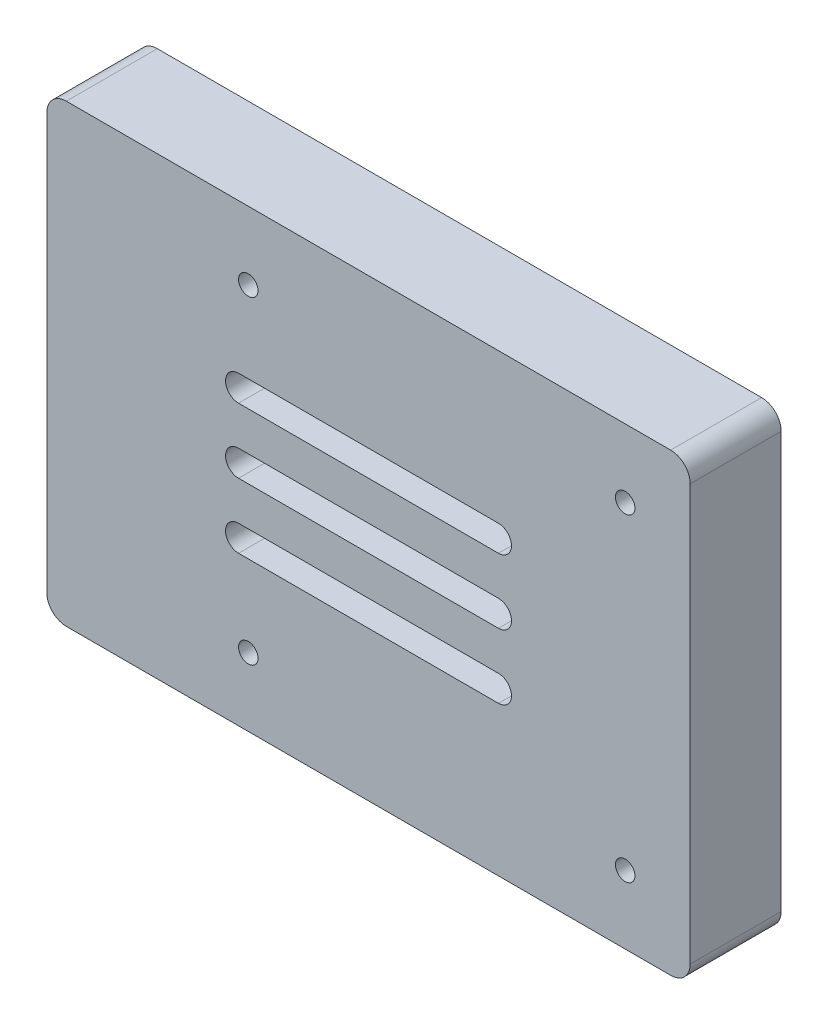
ISO-10303-21;
HEADER;
FILE_DESCRIPTION(('STEP AP214'),'2;1');
FILE_NAME('part.step','',(''),(''),'','','');
FILE_SCHEMA(('AUTOMOTIVE_DESIGN { 1 0 10303 214 1 1 1 1 }'));
ENDSEC;
DATA;
#1=APPLICATION_CONTEXT('core data for automotive mechanical design processes');
#2=APPLICATION_PROTOCOL_DEFINITION('international standard','automotive_design',2000,#1);
#3=PRODUCT_CONTEXT('',#1,'mechanical');
#4=PRODUCT('Part','Part','',(#3));
#5=PRODUCT_RELATED_PRODUCT_CATEGORY('part','',(#4));
#6=PRODUCT_DEFINITION_FORMATION('','',#4);
#7=PRODUCT_DEFINITION_CONTEXT('part definition',#1,'design');
#8=PRODUCT_DEFINITION('design','',#6,#7);
#9=PRODUCT_DEFINITION_SHAPE('','',#8);
#10=(LENGTH_UNIT() NAMED_UNIT(*) SI_UNIT(.MILLI.,.METRE.));
#11=(NAMED_UNIT(*) PLANE_ANGLE_UNIT() SI_UNIT($,.RADIAN.));
#12=(NAMED_UNIT(*) SI_UNIT($,.STERADIAN.) SOLID_ANGLE_UNIT());
#13=UNCERTAINTY_MEASURE_WITH_UNIT(LENGTH_MEASURE(1.E-05),#10,'distance_accuracy_value','');
#14=(GEOMETRIC_REPRESENTATION_CONTEXT(3) GLOBAL_UNCERTAINTY_ASSIGNED_CONTEXT((#13)) GLOBAL_UNIT_ASSIGNED_CONTEXT((#10,
#11,#12)) REPRESENTATION_CONTEXT('',''));
#15=CARTESIAN_POINT('',(0.,0.,0.));
#16=DIRECTION('',(0.,0.,1.));
#17=DIRECTION('',(1.,0.,0.));
#18=AXIS2_PLACEMENT_3D('',#15,#16,#17);
#19=CARTESIAN_POINT('',(0.,-35.,10.));
#20=DIRECTION('',(0.,1.,0.));
#21=DIRECTION('',(0.,0.,1.));
#22=AXIS2_PLACEMENT_3D('',#19,#20,#21);
#23=PLANE('',#22);
#24=DIRECTION('',(1.,0.,0.));
#25=VECTOR('',#24,1.);
#26=CARTESIAN_POINT('',(0.,-35.,0.));
#27=LINE('',#26,#25);
#28=CARTESIAN_POINT('',(-46.5,-35.,0.));
#29=VERTEX_POINT('',#28);
#30=CARTESIAN_POINT('',(46.5,-35.,0.));
#31=VERTEX_POINT('',#30);
#32=EDGE_CURVE('E487',#29,#31,#27,.T.);
#33=ORIENTED_EDGE('',*,*,#32,.T.);
#34=DIRECTION('',(0.,0.,-1.));
#35=VECTOR('',#34,1.);
#36=CARTESIAN_POINT('',(46.5,-35.,10.));
#37=LINE('',#36,#35);
#38=CARTESIAN_POINT('',(46.5,-35.,14.));
#39=VERTEX_POINT('',#38);
#40=EDGE_CURVE('E11',#39,#31,#37,.T.);
#41=ORIENTED_EDGE('',*,*,#40,.F.);
#42=DIRECTION('',(-1.,0.,0.));
#43=VECTOR('',#42,1.);
#44=CARTESIAN_POINT('',(0.,-35.,14.));
#45=LINE('',#44,#43);
#46=CARTESIAN_POINT('',(-46.5,-35.,14.));
#47=VERTEX_POINT('',#46);
#48=EDGE_CURVE('E418',#39,#47,#45,.T.);
#49=ORIENTED_EDGE('',*,*,#48,.T.);
#50=DIRECTION('',(0.,0.,-1.));
#51=VECTOR('',#50,1.);
#52=CARTESIAN_POINT('',(-46.5,-35.,10.));
#53=LINE('',#52,#51);
#54=EDGE_CURVE('E517',#47,#29,#53,.T.);
#55=ORIENTED_EDGE('',*,*,#54,.T.);
#56=EDGE_LOOP('',(#33,#41,#49,#55));
#57=FACE_BOUND('',#56,.T.);
#58=ADVANCED_FACE('F41',(#57),#23,.F.);
#59=CARTESIAN_POINT('',(46.5,-32.,10.));
#60=DIRECTION('',(0.,0.,-1.));
#61=DIRECTION('',(-1.,0.,0.));
#62=AXIS2_PLACEMENT_3D('',#59,#60,#61);
#63=CYLINDRICAL_SURFACE('',#62,3.);
#64=CARTESIAN_POINT('',(46.5,-32.,0.));
#65=DIRECTION('',(0.,0.,1.));
#66=DIRECTION('',(1.,0.,0.));
#67=AXIS2_PLACEMENT_3D('',#64,#65,#66);
#68=CIRCLE('',#67,3.);
#69=CARTESIAN_POINT('',(49.5,-32.,0.));
#70=VERTEX_POINT('',#69);
#71=EDGE_CURVE('E491',#31,#70,#68,.T.);
#72=ORIENTED_EDGE('',*,*,#71,.T.);
#73=DIRECTION('',(0.,0.,-1.));
#74=VECTOR('',#73,1.);
#75=CARTESIAN_POINT('',(49.5,-32.,10.));
#76=LINE('',#75,#74);
#77=CARTESIAN_POINT('',(49.5,-32.,14.));
#78=VERTEX_POINT('',#77);
#79=EDGE_CURVE('E51',#78,#70,#76,.T.);
#80=ORIENTED_EDGE('',*,*,#79,.F.);
#81=CARTESIAN_POINT('',(46.5,-32.,14.));
#82=DIRECTION('',(0.,0.,1.));
#83=DIRECTION('',(1.,0.,0.));
#84=AXIS2_PLACEMENT_3D('',#81,#82,#83);
#85=CIRCLE('',#84,3.);
#86=EDGE_CURVE('E422',#39,#78,#85,.T.);
#87=ORIENTED_EDGE('',*,*,#86,.F.);
#88=ORIENTED_EDGE('',*,*,#40,.T.);
#89=EDGE_LOOP('',(#72,#80,#87,#88));
#90=FACE_BOUND('',#89,.T.);
#91=ADVANCED_FACE('F611',(#90),#63,.T.);
#92=CARTESIAN_POINT('',(49.5,0.,10.));
#93=DIRECTION('',(-1.,0.,0.));
#94=DIRECTION('',(0.,-1.,0.));
#95=AXIS2_PLACEMENT_3D('',#92,#93,#94);
#96=PLANE('',#95);
#97=DIRECTION('',(0.,1.,0.));
#98=VECTOR('',#97,1.);
#99=CARTESIAN_POINT('',(49.5,0.,0.));
#100=LINE('',#99,#98);
#101=CARTESIAN_POINT('',(49.5,32.,0.));
#102=VERTEX_POINT('',#101);
#103=EDGE_CURVE('E494',#70,#102,#100,.T.);
#104=ORIENTED_EDGE('',*,*,#103,.T.);
#105=DIRECTION('',(0.,0.,-1.));
#106=VECTOR('',#105,1.);
#107=CARTESIAN_POINT('',(49.5,32.,10.));
#108=LINE('',#107,#106);
#109=CARTESIAN_POINT('',(49.5,32.,14.));
#110=VERTEX_POINT('',#109);
#111=EDGE_CURVE('E532',#110,#102,#108,.T.);
#112=ORIENTED_EDGE('',*,*,#111,.F.);
#113=DIRECTION('',(0.,-1.,0.));
#114=VECTOR('',#113,1.);
#115=CARTESIAN_POINT('',(49.5,0.,14.));
#116=LINE('',#115,#114);
#117=EDGE_CURVE('E426',#110,#78,#116,.T.);
#118=ORIENTED_EDGE('',*,*,#117,.T.);
#119=ORIENTED_EDGE('',*,*,#79,.T.);
#120=EDGE_LOOP('',(#104,#112,#118,#119));
#121=FACE_BOUND('',#120,.T.);
#122=ADVANCED_FACE('F617',(#121),#96,.F.);
#123=CARTESIAN_POINT('',(46.5,32.,10.));
#124=DIRECTION('',(0.,0.,-1.));
#125=DIRECTION('',(-1.,0.,0.));
#126=AXIS2_PLACEMENT_3D('',#123,#124,#125);
#127=CYLINDRICAL_SURFACE('',#126,3.);
#128=CARTESIAN_POINT('',(46.5,32.,0.));
#129=DIRECTION('',(0.,0.,1.));
#130=DIRECTION('',(1.,0.,0.));
#131=AXIS2_PLACEMENT_3D('',#128,#129,#130);
#132=CIRCLE('',#131,3.);
#133=CARTESIAN_POINT('',(46.5,35.,0.));
#134=VERTEX_POINT('',#133);
#135=EDGE_CURVE('E498',#134,#102,#132,.F.);
#136=ORIENTED_EDGE('',*,*,#135,.F.);
#137=DIRECTION('',(0.,0.,-1.));
#138=VECTOR('',#137,1.);
#139=CARTESIAN_POINT('',(46.5,35.,10.));
#140=LINE('',#139,#138);
#141=CARTESIAN_POINT('',(46.5,35.,14.));
#142=VERTEX_POINT('',#141);
#143=EDGE_CURVE('E529',#142,#134,#140,.T.);
#144=ORIENTED_EDGE('',*,*,#143,.F.);
#145=CARTESIAN_POINT('',(46.5,32.,14.));
#146=DIRECTION('',(0.,0.,1.));
#147=DIRECTION('',(1.,0.,0.));
#148=AXIS2_PLACEMENT_3D('',#145,#146,#147);
#149=CIRCLE('',#148,3.);
#150=EDGE_CURVE('E398',#110,#142,#149,.T.);
#151=ORIENTED_EDGE('',*,*,#150,.F.);
#152=ORIENTED_EDGE('',*,*,#111,.T.);
#153=EDGE_LOOP('',(#136,#144,#151,#152));
#154=FACE_BOUND('',#153,.T.);
#155=ADVANCED_FACE('F861',(#154),#127,.T.);
#156=CARTESIAN_POINT('',(0.,35.,10.));
#157=DIRECTION('',(0.,1.,0.));
#158=DIRECTION('',(0.,0.,1.));
#159=AXIS2_PLACEMENT_3D('',#156,#157,#158);
#160=PLANE('',#159);
#161=DIRECTION('',(1.,0.,0.));
#162=VECTOR('',#161,1.);
#163=CARTESIAN_POINT('',(0.,35.,0.));
#164=LINE('',#163,#162);
#165=CARTESIAN_POINT('',(-46.5,35.,0.));
#166=VERTEX_POINT('',#165);
#167=EDGE_CURVE('E502',#166,#134,#164,.T.);
#168=ORIENTED_EDGE('',*,*,#167,.F.);
#169=DIRECTION('',(0.,0.,-1.));
#170=VECTOR('',#169,1.);
#171=CARTESIAN_POINT('',(-46.5,35.,10.));
#172=LINE('',#171,#170);
#173=CARTESIAN_POINT('',(-46.5,35.,14.));
#174=VERTEX_POINT('',#173);
#175=EDGE_CURVE('E526',#174,#166,#172,.T.);
#176=ORIENTED_EDGE('',*,*,#175,.F.);
#177=DIRECTION('',(1.,0.,0.));
#178=VECTOR('',#177,1.);
#179=CARTESIAN_POINT('',(0.,35.,14.));
#180=LINE('',#179,#178);
#181=EDGE_CURVE('E402',#174,#142,#180,.T.);
#182=ORIENTED_EDGE('',*,*,#181,.T.);
#183=ORIENTED_EDGE('',*,*,#143,.T.);
#184=EDGE_LOOP('',(#168,#176,#182,#183));
#185=FACE_BOUND('',#184,.T.);
#186=ADVANCED_FACE('F849',(#185),#160,.T.);
#187=CARTESIAN_POINT('',(-46.5,32.,10.));
#188=DIRECTION('',(0.,0.,-1.));
#189=DIRECTION('',(-1.,0.,0.));
#190=AXIS2_PLACEMENT_3D('',#187,#188,#189);
#191=CYLINDRICAL_SURFACE('',#190,3.);
#192=CARTESIAN_POINT('',(-46.5,32.,0.));
#193=DIRECTION('',(0.,0.,1.));
#194=DIRECTION('',(1.,0.,0.));
#195=AXIS2_PLACEMENT_3D('',#192,#193,#194);
#196=CIRCLE('',#195,3.);
#197=CARTESIAN_POINT('',(-49.5,32.,0.));
#198=VERTEX_POINT('',#197);
#199=EDGE_CURVE('E506',#198,#166,#196,.F.);
#200=ORIENTED_EDGE('',*,*,#199,.F.);
#201=DIRECTION('',(0.,0.,-1.));
#202=VECTOR('',#201,1.);
#203=CARTESIAN_POINT('',(-49.5,32.,10.));
#204=LINE('',#203,#202);
#205=CARTESIAN_POINT('',(-49.5,32.,14.));
#206=VERTEX_POINT('',#205);
#207=EDGE_CURVE('E523',#206,#198,#204,.T.);
#208=ORIENTED_EDGE('',*,*,#207,.F.);
#209=CARTESIAN_POINT('',(-46.5,32.,14.));
#210=DIRECTION('',(0.,0.,1.));
#211=DIRECTION('',(1.,0.,0.));
#212=AXIS2_PLACEMENT_3D('',#209,#210,#211);
#213=CIRCLE('',#212,3.);
#214=EDGE_CURVE('E406',#174,#206,#213,.T.);
#215=ORIENTED_EDGE('',*,*,#214,.F.);
#216=ORIENTED_EDGE('',*,*,#175,.T.);
#217=EDGE_LOOP('',(#200,#208,#215,#216));
#218=FACE_BOUND('',#217,.T.);
#219=ADVANCED_FACE('F835',(#218),#191,.T.);
#220=CARTESIAN_POINT('',(-49.5,0.,10.));
#221=DIRECTION('',(-1.,0.,0.));
#222=DIRECTION('',(0.,0.,1.));
#223=AXIS2_PLACEMENT_3D('',#220,#221,#222);
#224=PLANE('',#223);
#225=DIRECTION('',(0.,1.,0.));
#226=VECTOR('',#225,1.);
#227=CARTESIAN_POINT('',(-49.5,0.,0.));
#228=LINE('',#227,#226);
#229=CARTESIAN_POINT('',(-49.5,-32.,0.));
#230=VERTEX_POINT('',#229);
#231=EDGE_CURVE('E510',#230,#198,#228,.T.);
#232=ORIENTED_EDGE('',*,*,#231,.F.);
#233=DIRECTION('',(0.,0.,-1.));
#234=VECTOR('',#233,1.);
#235=CARTESIAN_POINT('',(-49.5,-32.,10.));
#236=LINE('',#235,#234);
#237=CARTESIAN_POINT('',(-49.5,-32.,14.));
#238=VERTEX_POINT('',#237);
#239=EDGE_CURVE('E520',#238,#230,#236,.T.);
#240=ORIENTED_EDGE('',*,*,#239,.F.);
#241=DIRECTION('',(0.,1.,0.));
#242=VECTOR('',#241,1.);
#243=CARTESIAN_POINT('',(-49.5,0.,14.));
#244=LINE('',#243,#242);
#245=EDGE_CURVE('E410',#238,#206,#244,.T.);
#246=ORIENTED_EDGE('',*,*,#245,.T.);
#247=ORIENTED_EDGE('',*,*,#207,.T.);
#248=EDGE_LOOP('',(#232,#240,#246,#247));
#249=FACE_BOUND('',#248,.T.);
#250=ADVANCED_FACE('F828',(#249),#224,.T.);
#251=CARTESIAN_POINT('',(44.5,-30.,10.));
#252=DIRECTION('',(0.,0.,-1.));
#253=DIRECTION('',(-1.,0.,0.));
#254=AXIS2_PLACEMENT_3D('',#251,#252,#253);
#255=CYLINDRICAL_SURFACE('',#254,3.);
#256=CARTESIAN_POINT('',(44.5,-30.,0.));
#257=DIRECTION('',(0.,0.,1.));
#258=DIRECTION('',(1.,0.,0.));
#259=AXIS2_PLACEMENT_3D('',#256,#257,#258);
#260=CIRCLE('',#259,3.);
#261=CARTESIAN_POINT('',(44.5,-33.,0.));
#262=VERTEX_POINT('',#261);
#263=CARTESIAN_POINT('',(47.5,-30.,0.));
#264=VERTEX_POINT('',#263);
#265=EDGE_CURVE('E430',#262,#264,#260,.T.);
#266=ORIENTED_EDGE('',*,*,#265,.F.);
#267=DIRECTION('',(0.,0.,-1.));
#268=VECTOR('',#267,1.);
#269=CARTESIAN_POINT('',(44.5,-33.,10.));
#270=LINE('',#269,#268);
#271=CARTESIAN_POINT('',(44.5,-33.,10.));
#272=VERTEX_POINT('',#271);
#273=EDGE_CURVE('E45',#272,#262,#270,.T.);
#274=ORIENTED_EDGE('',*,*,#273,.F.);
#275=CARTESIAN_POINT('',(44.5,-30.,10.));
#276=DIRECTION('',(0.,0.,1.));
#277=DIRECTION('',(1.,0.,0.));
#278=AXIS2_PLACEMENT_3D('',#275,#276,#277);
#279=CIRCLE('',#278,3.);
#280=CARTESIAN_POINT('',(47.5,-30.,10.));
#281=VERTEX_POINT('',#280);
#282=EDGE_CURVE('E431',#272,#281,#279,.T.);
#283=ORIENTED_EDGE('',*,*,#282,.T.);
#284=DIRECTION('',(0.,0.,-1.));
#285=VECTOR('',#284,1.);
#286=CARTESIAN_POINT('',(47.5,-30.,10.));
#287=LINE('',#286,#285);
#288=EDGE_CURVE('E459',#281,#264,#287,.T.);
#289=ORIENTED_EDGE('',*,*,#288,.T.);
#290=EDGE_LOOP('',(#266,#274,#283,#289));
#291=FACE_BOUND('',#290,.T.);
#292=ADVANCED_FACE('F43',(#291),#255,.F.);
#293=CARTESIAN_POINT('',(0.,-33.,10.));
#294=DIRECTION('',(0.,1.,0.));
#295=DIRECTION('',(0.,0.,1.));
#296=AXIS2_PLACEMENT_3D('',#293,#294,#295);
#297=PLANE('',#296);
#298=DIRECTION('',(1.,0.,0.));
#299=VECTOR('',#298,1.);
#300=CARTESIAN_POINT('',(0.,-33.,0.));
#301=LINE('',#300,#299);
#302=CARTESIAN_POINT('',(-44.5,-33.,0.));
#303=VERTEX_POINT('',#302);
#304=EDGE_CURVE('E463',#303,#262,#301,.T.);
#305=ORIENTED_EDGE('',*,*,#304,.F.);
#306=DIRECTION('',(0.,0.,-1.));
#307=VECTOR('',#306,1.);
#308=CARTESIAN_POINT('',(-44.5,-33.,10.));
#309=LINE('',#308,#307);
#310=CARTESIAN_POINT('',(-44.5,-33.,10.));
#311=VERTEX_POINT('',#310);
#312=EDGE_CURVE('E558',#311,#303,#309,.T.);
#313=ORIENTED_EDGE('',*,*,#312,.F.);
#314=DIRECTION('',(1.,0.,0.));
#315=VECTOR('',#314,1.);
#316=CARTESIAN_POINT('',(0.,-33.,10.));
#317=LINE('',#316,#315);
#318=EDGE_CURVE('E435',#311,#272,#317,.T.);
#319=ORIENTED_EDGE('',*,*,#318,.T.);
#320=ORIENTED_EDGE('',*,*,#273,.T.);
#321=EDGE_LOOP('',(#305,#313,#319,#320));
#322=FACE_BOUND('',#321,.T.);
#323=ADVANCED_FACE('F569',(#322),#297,.T.);
#324=CARTESIAN_POINT('',(-44.5,-30.,10.));
#325=DIRECTION('',(0.,0.,-1.));
#326=DIRECTION('',(-1.,0.,0.));
#327=AXIS2_PLACEMENT_3D('',#324,#325,#326);
#328=CYLINDRICAL_SURFACE('',#327,3.);
#329=CARTESIAN_POINT('',(-44.5,-30.,0.));
#330=DIRECTION('',(0.,0.,1.));
#331=DIRECTION('',(1.,0.,0.));
#332=AXIS2_PLACEMENT_3D('',#329,#330,#331);
#333=CIRCLE('',#332,3.);
#334=CARTESIAN_POINT('',(-47.5,-30.,0.));
#335=VERTEX_POINT('',#334);
#336=EDGE_CURVE('E467',#303,#335,#333,.F.);
#337=ORIENTED_EDGE('',*,*,#336,.T.);
#338=DIRECTION('',(0.,0.,-1.));
#339=VECTOR('',#338,1.);
#340=CARTESIAN_POINT('',(-47.5,-30.,10.));
#341=LINE('',#340,#339);
#342=CARTESIAN_POINT('',(-47.5,-30.,10.));
#343=VERTEX_POINT('',#342);
#344=EDGE_CURVE('E555',#343,#335,#341,.T.);
#345=ORIENTED_EDGE('',*,*,#344,.F.);
#346=CARTESIAN_POINT('',(-44.5,-30.,10.));
#347=DIRECTION('',(0.,0.,1.));
#348=DIRECTION('',(1.,0.,0.));
#349=AXIS2_PLACEMENT_3D('',#346,#347,#348);
#350=CIRCLE('',#349,3.);
#351=EDGE_CURVE('E440',#311,#343,#350,.F.);
#352=ORIENTED_EDGE('',*,*,#351,.F.);
#353=ORIENTED_EDGE('',*,*,#312,.T.);
#354=EDGE_LOOP('',(#337,#345,#352,#353));
#355=FACE_BOUND('',#354,.T.);
#356=ADVANCED_FACE('F579',(#355),#328,.F.);
#357=CARTESIAN_POINT('',(-47.5,0.,10.));
#358=DIRECTION('',(-1.,0.,0.));
#359=DIRECTION('',(0.,0.,1.));
#360=AXIS2_PLACEMENT_3D('',#357,#358,#359);
#361=PLANE('',#360);
#362=DIRECTION('',(0.,1.,0.));
#363=VECTOR('',#362,1.);
#364=CARTESIAN_POINT('',(-47.5,0.,0.));
#365=LINE('',#364,#363);
#366=CARTESIAN_POINT('',(-47.5,30.,0.));
#367=VERTEX_POINT('',#366);
#368=EDGE_CURVE('E470',#335,#367,#365,.T.);
#369=ORIENTED_EDGE('',*,*,#368,.T.);
#370=DIRECTION('',(0.,0.,-1.));
#371=VECTOR('',#370,1.);
#372=CARTESIAN_POINT('',(-47.5,30.,10.));
#373=LINE('',#372,#371);
#374=CARTESIAN_POINT('',(-47.5,30.,10.));
#375=VERTEX_POINT('',#374);
#376=EDGE_CURVE('E551',#375,#367,#373,.T.);
#377=ORIENTED_EDGE('',*,*,#376,.F.);
#378=DIRECTION('',(0.,1.,0.));
#379=VECTOR('',#378,1.);
#380=CARTESIAN_POINT('',(-47.5,0.,10.));
#381=LINE('',#380,#379);
#382=EDGE_CURVE('E443',#343,#375,#381,.T.);
#383=ORIENTED_EDGE('',*,*,#382,.F.);
#384=ORIENTED_EDGE('',*,*,#344,.T.);
#385=EDGE_LOOP('',(#369,#377,#383,#384));
#386=FACE_BOUND('',#385,.T.);
#387=ADVANCED_FACE('F582',(#386),#361,.F.);
#388=CARTESIAN_POINT('',(-44.5,30.,10.));
#389=DIRECTION('',(0.,0.,-1.));
#390=DIRECTION('',(-1.,0.,0.));
#391=AXIS2_PLACEMENT_3D('',#388,#389,#390);
#392=CYLINDRICAL_SURFACE('',#391,3.);
#393=CARTESIAN_POINT('',(-44.5,30.,0.));
#394=DIRECTION('',(0.,0.,1.));
#395=DIRECTION('',(1.,0.,0.));
#396=AXIS2_PLACEMENT_3D('',#393,#394,#395);
#397=CIRCLE('',#396,3.);
#398=CARTESIAN_POINT('',(-44.5,33.,0.));
#399=VERTEX_POINT('',#398);
#400=EDGE_CURVE('E473',#367,#399,#397,.F.);
#401=ORIENTED_EDGE('',*,*,#400,.T.);
#402=DIRECTION('',(0.,0.,-1.));
#403=VECTOR('',#402,1.);
#404=CARTESIAN_POINT('',(-44.5,33.,10.));
#405=LINE('',#404,#403);
#406=CARTESIAN_POINT('',(-44.5,33.,10.));
#407=VERTEX_POINT('',#406);
#408=EDGE_CURVE('E547',#407,#399,#405,.T.);
#409=ORIENTED_EDGE('',*,*,#408,.F.);
#410=CARTESIAN_POINT('',(-44.5,30.,10.));
#411=DIRECTION('',(0.,0.,1.));
#412=DIRECTION('',(1.,0.,0.));
#413=AXIS2_PLACEMENT_3D('',#410,#411,#412);
#414=CIRCLE('',#413,3.);
#415=EDGE_CURVE('E446',#375,#407,#414,.F.);
#416=ORIENTED_EDGE('',*,*,#415,.F.);
#417=ORIENTED_EDGE('',*,*,#376,.T.);
#418=EDGE_LOOP('',(#401,#409,#416,#417));
#419=FACE_BOUND('',#418,.T.);
#420=ADVANCED_FACE('F601',(#419),#392,.F.);
#421=CARTESIAN_POINT('',(0.,33.,10.));
#422=DIRECTION('',(0.,1.,0.));
#423=DIRECTION('',(0.,0.,1.));
#424=AXIS2_PLACEMENT_3D('',#421,#422,#423);
#425=PLANE('',#424);
#426=DIRECTION('',(1.,0.,0.));
#427=VECTOR('',#426,1.);
#428=CARTESIAN_POINT('',(0.,33.,0.));
#429=LINE('',#428,#427);
#430=CARTESIAN_POINT('',(44.5,33.,0.));
#431=VERTEX_POINT('',#430);
#432=EDGE_CURVE('E476',#399,#431,#429,.T.);
#433=ORIENTED_EDGE('',*,*,#432,.T.);
#434=DIRECTION('',(0.,0.,-1.));
#435=VECTOR('',#434,1.);
#436=CARTESIAN_POINT('',(44.5,33.,10.));
#437=LINE('',#436,#435);
#438=CARTESIAN_POINT('',(44.5,33.,10.));
#439=VERTEX_POINT('',#438);
#440=EDGE_CURVE('E543',#439,#431,#437,.T.);
#441=ORIENTED_EDGE('',*,*,#440,.F.);
#442=DIRECTION('',(1.,0.,0.));
#443=VECTOR('',#442,1.);
#444=CARTESIAN_POINT('',(0.,33.,10.));
#445=LINE('',#444,#443);
#446=EDGE_CURVE('E449',#407,#439,#445,.T.);
#447=ORIENTED_EDGE('',*,*,#446,.F.);
#448=ORIENTED_EDGE('',*,*,#408,.T.);
#449=EDGE_LOOP('',(#433,#441,#447,#448));
#450=FACE_BOUND('',#449,.T.);
#451=ADVANCED_FACE('F599',(#450),#425,.F.);
#452=CARTESIAN_POINT('',(44.5,30.,10.));
#453=DIRECTION('',(0.,0.,-1.));
#454=DIRECTION('',(-1.,0.,0.));
#455=AXIS2_PLACEMENT_3D('',#452,#453,#454);
#456=CYLINDRICAL_SURFACE('',#455,3.);
#457=CARTESIAN_POINT('',(44.5,30.,0.));
#458=DIRECTION('',(0.,0.,1.));
#459=DIRECTION('',(1.,0.,0.));
#460=AXIS2_PLACEMENT_3D('',#457,#458,#459);
#461=CIRCLE('',#460,3.);
#462=CARTESIAN_POINT('',(47.5,30.,0.));
#463=VERTEX_POINT('',#462);
#464=EDGE_CURVE('E479',#431,#463,#461,.F.);
#465=ORIENTED_EDGE('',*,*,#464,.T.);
#466=DIRECTION('',(0.,0.,-1.));
#467=VECTOR('',#466,1.);
#468=CARTESIAN_POINT('',(47.5,30.,10.));
#469=LINE('',#468,#467);
#470=CARTESIAN_POINT('',(47.5,30.,10.));
#471=VERTEX_POINT('',#470);
#472=EDGE_CURVE('E540',#471,#463,#469,.T.);
#473=ORIENTED_EDGE('',*,*,#472,.F.);
#474=CARTESIAN_POINT('',(44.5,30.,10.));
#475=DIRECTION('',(0.,0.,1.));
#476=DIRECTION('',(1.,0.,0.));
#477=AXIS2_PLACEMENT_3D('',#474,#475,#476);
#478=CIRCLE('',#477,3.);
#479=EDGE_CURVE('E452',#439,#471,#478,.F.);
#480=ORIENTED_EDGE('',*,*,#479,.F.);
#481=ORIENTED_EDGE('',*,*,#440,.T.);
#482=EDGE_LOOP('',(#465,#473,#480,#481));
#483=FACE_BOUND('',#482,.T.);
#484=ADVANCED_FACE('F595',(#483),#456,.F.);
#485=CARTESIAN_POINT('',(47.5,0.,10.));
#486=DIRECTION('',(-1.,0.,0.));
#487=DIRECTION('',(0.,0.,1.));
#488=AXIS2_PLACEMENT_3D('',#485,#486,#487);
#489=PLANE('',#488);
#490=DIRECTION('',(0.,1.,0.));
#491=VECTOR('',#490,1.);
#492=CARTESIAN_POINT('',(47.5,0.,0.));
#493=LINE('',#492,#491);
#494=EDGE_CURVE('E483',#264,#463,#493,.T.);
#495=ORIENTED_EDGE('',*,*,#494,.F.);
#496=ORIENTED_EDGE('',*,*,#288,.F.);
#497=DIRECTION('',(0.,1.,0.));
#498=VECTOR('',#497,1.);
#499=CARTESIAN_POINT('',(47.5,0.,10.));
#500=LINE('',#499,#498);
#501=EDGE_CURVE('E455',#281,#471,#500,.T.);
#502=ORIENTED_EDGE('',*,*,#501,.T.);
#503=ORIENTED_EDGE('',*,*,#472,.T.);
#504=EDGE_LOOP('',(#495,#496,#502,#503));
#505=FACE_BOUND('',#504,.T.);
#506=ADVANCED_FACE('F591',(#505),#489,.T.);
#507=CARTESIAN_POINT('',(-46.5,-32.,10.));
#508=DIRECTION('',(0.,0.,-1.));
#509=DIRECTION('',(-1.,0.,0.));
#510=AXIS2_PLACEMENT_3D('',#507,#508,#509);
#511=CYLINDRICAL_SURFACE('',#510,3.);
#512=CARTESIAN_POINT('',(-46.5,-32.,0.));
#513=DIRECTION('',(0.,0.,1.));
#514=DIRECTION('',(1.,0.,0.));
#515=AXIS2_PLACEMENT_3D('',#512,#513,#514);
#516=CIRCLE('',#515,3.);
#517=EDGE_CURVE('E436',#29,#230,#516,.F.);
#518=ORIENTED_EDGE('',*,*,#517,.F.);
#519=ORIENTED_EDGE('',*,*,#54,.F.);
#520=CARTESIAN_POINT('',(-46.5,-32.,14.));
#521=DIRECTION('',(0.,0.,1.));
#522=DIRECTION('',(1.,0.,0.));
#523=AXIS2_PLACEMENT_3D('',#520,#521,#522);
#524=CIRCLE('',#523,3.);
#525=EDGE_CURVE('E414',#238,#47,#524,.T.);
#526=ORIENTED_EDGE('',*,*,#525,.F.);
#527=ORIENTED_EDGE('',*,*,#239,.T.);
#528=EDGE_LOOP('',(#518,#519,#526,#527));
#529=FACE_BOUND('',#528,.T.);
#530=ADVANCED_FACE('F624',(#529),#511,.T.);
#531=CARTESIAN_POINT('',(0.,0.,0.));
#532=DIRECTION('',(0.,0.,1.));
#533=DIRECTION('',(1.,0.,0.));
#534=AXIS2_PLACEMENT_3D('',#531,#532,#533);
#535=PLANE('',#534);
#536=ORIENTED_EDGE('',*,*,#265,.T.);
#537=ORIENTED_EDGE('',*,*,#494,.T.);
#538=ORIENTED_EDGE('',*,*,#464,.F.);
#539=ORIENTED_EDGE('',*,*,#432,.F.);
#540=ORIENTED_EDGE('',*,*,#400,.F.);
#541=ORIENTED_EDGE('',*,*,#368,.F.);
#542=ORIENTED_EDGE('',*,*,#336,.F.);
#543=ORIENTED_EDGE('',*,*,#304,.T.);
#544=EDGE_LOOP('',(#536,#537,#538,#539,#540,#541,#542,#543));
#545=FACE_BOUND('',#544,.T.);
#546=ORIENTED_EDGE('',*,*,#32,.F.);
#547=ORIENTED_EDGE('',*,*,#517,.T.);
#548=ORIENTED_EDGE('',*,*,#231,.T.);
#549=ORIENTED_EDGE('',*,*,#199,.T.);
#550=ORIENTED_EDGE('',*,*,#167,.T.);
#551=ORIENTED_EDGE('',*,*,#135,.T.);
#552=ORIENTED_EDGE('',*,*,#103,.F.);
#553=ORIENTED_EDGE('',*,*,#71,.F.);
#554=EDGE_LOOP('',(#546,#547,#548,#549,#550,#551,#552,#553));
#555=FACE_BOUND('',#554,.T.);
#556=ADVANCED_FACE('F574',(#545,#555),#535,.F.);
#557=CARTESIAN_POINT('',(46.5,32.,10.));
#558=DIRECTION('',(0.,0.,1.));
#559=DIRECTION('',(1.,0.,0.));
#560=AXIS2_PLACEMENT_3D('',#557,#558,#559);
#561=PLANE('',#560);
#562=DIRECTION('',(1.,0.,0.));
#563=VECTOR('',#562,1.);
#564=CARTESIAN_POINT('',(46.5,7.99999999999999,10.));
#565=LINE('',#564,#563);
#566=CARTESIAN_POINT('',(-20.,8.,10.));
#567=VERTEX_POINT('',#566);
#568=CARTESIAN_POINT('',(20.,7.99999999999999,10.));
#569=VERTEX_POINT('',#568);
#570=EDGE_CURVE('E358',#567,#569,#565,.T.);
#571=ORIENTED_EDGE('',*,*,#570,.T.);
#572=CARTESIAN_POINT('',(20.,10.,10.));
#573=DIRECTION('',(0.,0.,1.));
#574=DIRECTION('',(1.,0.,0.));
#575=AXIS2_PLACEMENT_3D('',#572,#573,#574);
#576=CIRCLE('',#575,2.);
#577=CARTESIAN_POINT('',(20.,12.,10.));
#578=VERTEX_POINT('',#577);
#579=EDGE_CURVE('E362',#569,#578,#576,.T.);
#580=ORIENTED_EDGE('',*,*,#579,.T.);
#581=DIRECTION('',(-1.,0.,0.));
#582=VECTOR('',#581,1.);
#583=CARTESIAN_POINT('',(46.5,12.,10.));
#584=LINE('',#583,#582);
#585=CARTESIAN_POINT('',(-20.,12.,10.));
#586=VERTEX_POINT('',#585);
#587=EDGE_CURVE('E350',#578,#586,#584,.T.);
#588=ORIENTED_EDGE('',*,*,#587,.T.);
#589=CARTESIAN_POINT('',(-20.,10.,10.));
#590=DIRECTION('',(0.,0.,1.));
#591=DIRECTION('',(1.,0.,0.));
#592=AXIS2_PLACEMENT_3D('',#589,#590,#591);
#593=CIRCLE('',#592,2.);
#594=EDGE_CURVE('E354',#586,#567,#593,.T.);
#595=ORIENTED_EDGE('',*,*,#594,.T.);
#596=EDGE_LOOP('',(#571,#580,#588,#595));
#597=FACE_BOUND('',#596,.T.);
#598=DIRECTION('',(1.,0.,0.));
#599=VECTOR('',#598,1.);
#600=CARTESIAN_POINT('',(46.5,-12.,10.));
#601=LINE('',#600,#599);
#602=CARTESIAN_POINT('',(-19.9999999999999,-12.,10.));
#603=VERTEX_POINT('',#602);
#604=CARTESIAN_POINT('',(20.0000000000001,-12.,10.));
#605=VERTEX_POINT('',#604);
#606=EDGE_CURVE('E342',#603,#605,#601,.T.);
#607=ORIENTED_EDGE('',*,*,#606,.T.);
#608=CARTESIAN_POINT('',(20.0000000000001,-10.,10.));
#609=DIRECTION('',(0.,0.,1.));
#610=DIRECTION('',(1.,0.,0.));
#611=AXIS2_PLACEMENT_3D('',#608,#609,#610);
#612=CIRCLE('',#611,2.);
#613=CARTESIAN_POINT('',(20.0000000000001,-8.,10.));
#614=VERTEX_POINT('',#613);
#615=EDGE_CURVE('E346',#605,#614,#612,.T.);
#616=ORIENTED_EDGE('',*,*,#615,.T.);
#617=DIRECTION('',(-1.,0.,0.));
#618=VECTOR('',#617,1.);
#619=CARTESIAN_POINT('',(46.5,-8.00000000000001,10.));
#620=LINE('',#619,#618);
#621=CARTESIAN_POINT('',(-19.9999999999999,-8.,10.));
#622=VERTEX_POINT('',#621);
#623=EDGE_CURVE('E337',#614,#622,#620,.T.);
#624=ORIENTED_EDGE('',*,*,#623,.T.);
#625=CARTESIAN_POINT('',(-19.9999999999999,-10.,10.));
#626=DIRECTION('',(0.,0.,1.));
#627=DIRECTION('',(1.,0.,0.));
#628=AXIS2_PLACEMENT_3D('',#625,#626,#627);
#629=CIRCLE('',#628,2.);
#630=EDGE_CURVE('E234',#622,#603,#629,.T.);
#631=ORIENTED_EDGE('',*,*,#630,.T.);
#632=EDGE_LOOP('',(#607,#616,#624,#631));
#633=FACE_BOUND('',#632,.T.);
#634=DIRECTION('',(1.,0.,0.));
#635=VECTOR('',#634,1.);
#636=CARTESIAN_POINT('',(46.5,-2.00000000000002,10.));
#637=LINE('',#636,#635);
#638=CARTESIAN_POINT('',(-20.,-2.,10.));
#639=VERTEX_POINT('',#638);
#640=CARTESIAN_POINT('',(20.,-2.00000000000001,10.));
#641=VERTEX_POINT('',#640);
#642=EDGE_CURVE('E329',#639,#641,#637,.T.);
#643=ORIENTED_EDGE('',*,*,#642,.T.);
#644=CARTESIAN_POINT('',(20.,0.,10.));
#645=DIRECTION('',(0.,0.,1.));
#646=DIRECTION('',(1.,0.,0.));
#647=AXIS2_PLACEMENT_3D('',#644,#645,#646);
#648=CIRCLE('',#647,2.);
#649=CARTESIAN_POINT('',(20.,2.,10.));
#650=VERTEX_POINT('',#649);
#651=EDGE_CURVE('E333',#641,#650,#648,.T.);
#652=ORIENTED_EDGE('',*,*,#651,.T.);
#653=DIRECTION('',(-1.,0.,0.));
#654=VECTOR('',#653,1.);
#655=CARTESIAN_POINT('',(46.5,1.99999999999999,10.));
#656=LINE('',#655,#654);
#657=CARTESIAN_POINT('',(-20.,2.,10.));
#658=VERTEX_POINT('',#657);
#659=EDGE_CURVE('E312',#650,#658,#656,.T.);
#660=ORIENTED_EDGE('',*,*,#659,.T.);
#661=CARTESIAN_POINT('',(-20.,0.,10.));
#662=DIRECTION('',(0.,0.,1.));
#663=DIRECTION('',(1.,0.,0.));
#664=AXIS2_PLACEMENT_3D('',#661,#662,#663);
#665=CIRCLE('',#664,2.);
#666=EDGE_CURVE('E325',#658,#639,#665,.T.);
#667=ORIENTED_EDGE('',*,*,#666,.T.);
#668=EDGE_LOOP('',(#643,#652,#660,#667));
#669=FACE_BOUND('',#668,.T.);
#670=CARTESIAN_POINT('',(-18.5,24.5,10.));
#671=DIRECTION('',(0.,0.,1.));
#672=DIRECTION('',(1.,0.,0.));
#673=AXIS2_PLACEMENT_3D('',#670,#671,#672);
#674=CIRCLE('',#673,1.5);
#675=CARTESIAN_POINT('',(-17.,24.5,10.));
#676=VERTEX_POINT('',#675);
#677=EDGE_CURVE('E394',#676,#676,#674,.T.);
#678=ORIENTED_EDGE('',*,*,#677,.T.);
#679=EDGE_LOOP('',(#678));
#680=FACE_BOUND('',#679,.T.);
#681=CARTESIAN_POINT('',(39.5,-24.5,10.));
#682=DIRECTION('',(0.,0.,1.));
#683=DIRECTION('',(1.,0.,0.));
#684=AXIS2_PLACEMENT_3D('',#681,#682,#683);
#685=CIRCLE('',#684,1.5);
#686=CARTESIAN_POINT('',(41.,-24.5,10.));
#687=VERTEX_POINT('',#686);
#688=EDGE_CURVE('E390',#687,#687,#685,.T.);
#689=ORIENTED_EDGE('',*,*,#688,.T.);
#690=EDGE_LOOP('',(#689));
#691=FACE_BOUND('',#690,.T.);
#692=CARTESIAN_POINT('',(-18.5,-24.5,10.));
#693=DIRECTION('',(0.,0.,1.));
#694=DIRECTION('',(1.,0.,0.));
#695=AXIS2_PLACEMENT_3D('',#692,#693,#694);
#696=CIRCLE('',#695,1.5);
#697=CARTESIAN_POINT('',(-17.,-24.5,10.));
#698=VERTEX_POINT('',#697);
#699=EDGE_CURVE('E386',#698,#698,#696,.T.);
#700=ORIENTED_EDGE('',*,*,#699,.T.);
#701=EDGE_LOOP('',(#700));
#702=FACE_BOUND('',#701,.T.);
#703=CARTESIAN_POINT('',(39.5,24.5,10.));
#704=DIRECTION('',(0.,0.,1.));
#705=DIRECTION('',(1.,0.,0.));
#706=AXIS2_PLACEMENT_3D('',#703,#704,#705);
#707=CIRCLE('',#706,1.5);
#708=CARTESIAN_POINT('',(41.,24.5,10.));
#709=VERTEX_POINT('',#708);
#710=EDGE_CURVE('E382',#709,#709,#707,.T.);
#711=ORIENTED_EDGE('',*,*,#710,.T.);
#712=EDGE_LOOP('',(#711));
#713=FACE_BOUND('',#712,.T.);
#714=ORIENTED_EDGE('',*,*,#282,.F.);
#715=ORIENTED_EDGE('',*,*,#318,.F.);
#716=ORIENTED_EDGE('',*,*,#351,.T.);
#717=ORIENTED_EDGE('',*,*,#382,.T.);
#718=ORIENTED_EDGE('',*,*,#415,.T.);
#719=ORIENTED_EDGE('',*,*,#446,.T.);
#720=ORIENTED_EDGE('',*,*,#479,.T.);
#721=ORIENTED_EDGE('',*,*,#501,.F.);
#722=EDGE_LOOP('',(#714,#715,#716,#717,#718,#719,#720,#721));
#723=FACE_BOUND('',#722,.T.);
#724=ADVANCED_FACE('F586',(#597,#633,#669,#680,#691,#702,#713,#723),#561,.F.);
#725=CARTESIAN_POINT('',(46.5,32.,14.));
#726=DIRECTION('',(0.,0.,1.));
#727=DIRECTION('',(1.,0.,0.));
#728=AXIS2_PLACEMENT_3D('',#725,#726,#727);
#729=PLANE('',#728);
#730=CARTESIAN_POINT('',(20.,10.,14.));
#731=DIRECTION('',(0.,0.,1.));
#732=DIRECTION('',(1.,0.,0.));
#733=AXIS2_PLACEMENT_3D('',#730,#731,#732);
#734=CIRCLE('',#733,2.);
#735=CARTESIAN_POINT('',(20.,7.99999999999999,14.));
#736=VERTEX_POINT('',#735);
#737=CARTESIAN_POINT('',(20.,12.,14.));
#738=VERTEX_POINT('',#737);
#739=EDGE_CURVE('E268',#736,#738,#734,.T.);
#740=ORIENTED_EDGE('',*,*,#739,.F.);
#741=DIRECTION('',(1.,0.,0.));
#742=VECTOR('',#741,1.);
#743=CARTESIAN_POINT('',(20.,7.99999999999999,14.));
#744=LINE('',#743,#742);
#745=CARTESIAN_POINT('',(-20.,8.,14.));
#746=VERTEX_POINT('',#745);
#747=EDGE_CURVE('E278',#746,#736,#744,.T.);
#748=ORIENTED_EDGE('',*,*,#747,.F.);
#749=CARTESIAN_POINT('',(-20.,10.,14.));
#750=DIRECTION('',(0.,0.,1.));
#751=DIRECTION('',(1.,0.,0.));
#752=AXIS2_PLACEMENT_3D('',#749,#750,#751);
#753=CIRCLE('',#752,2.);
#754=CARTESIAN_POINT('',(-20.,12.,14.));
#755=VERTEX_POINT('',#754);
#756=EDGE_CURVE('E274',#755,#746,#753,.T.);
#757=ORIENTED_EDGE('',*,*,#756,.F.);
#758=DIRECTION('',(-1.,0.,0.));
#759=VECTOR('',#758,1.);
#760=CARTESIAN_POINT('',(20.,12.,14.));
#761=LINE('',#760,#759);
#762=EDGE_CURVE('E271',#738,#755,#761,.T.);
#763=ORIENTED_EDGE('',*,*,#762,.F.);
#764=EDGE_LOOP('',(#740,#748,#757,#763));
#765=FACE_BOUND('',#764,.T.);
#766=CARTESIAN_POINT('',(20.0000000000001,-10.,14.));
#767=DIRECTION('',(0.,0.,1.));
#768=DIRECTION('',(1.,0.,0.));
#769=AXIS2_PLACEMENT_3D('',#766,#767,#768);
#770=CIRCLE('',#769,2.);
#771=CARTESIAN_POINT('',(20.0000000000001,-12.,14.));
#772=VERTEX_POINT('',#771);
#773=CARTESIAN_POINT('',(20.0000000000001,-8.,14.));
#774=VERTEX_POINT('',#773);
#775=EDGE_CURVE('E248',#772,#774,#770,.T.);
#776=ORIENTED_EDGE('',*,*,#775,.F.);
#777=DIRECTION('',(1.,0.,0.));
#778=VECTOR('',#777,1.);
#779=CARTESIAN_POINT('',(20.0000000000001,-12.,14.));
#780=LINE('',#779,#778);
#781=CARTESIAN_POINT('',(-19.9999999999999,-12.,14.));
#782=VERTEX_POINT('',#781);
#783=EDGE_CURVE('E253',#782,#772,#780,.T.);
#784=ORIENTED_EDGE('',*,*,#783,.F.);
#785=CARTESIAN_POINT('',(-19.9999999999999,-10.,14.));
#786=DIRECTION('',(0.,0.,1.));
#787=DIRECTION('',(1.,0.,0.));
#788=AXIS2_PLACEMENT_3D('',#785,#786,#787);
#789=CIRCLE('',#788,2.);
#790=CARTESIAN_POINT('',(-19.9999999999999,-8.,14.));
#791=VERTEX_POINT('',#790);
#792=EDGE_CURVE('E231',#791,#782,#789,.T.);
#793=ORIENTED_EDGE('',*,*,#792,.F.);
#794=DIRECTION('',(-1.,0.,0.));
#795=VECTOR('',#794,1.);
#796=CARTESIAN_POINT('',(20.0000000000001,-8.,14.));
#797=LINE('',#796,#795);
#798=EDGE_CURVE('E242',#774,#791,#797,.T.);
#799=ORIENTED_EDGE('',*,*,#798,.F.);
#800=EDGE_LOOP('',(#776,#784,#793,#799));
#801=FACE_BOUND('',#800,.T.);
#802=CARTESIAN_POINT('',(20.,0.,14.));
#803=DIRECTION('',(0.,0.,1.));
#804=DIRECTION('',(1.,0.,0.));
#805=AXIS2_PLACEMENT_3D('',#802,#803,#804);
#806=CIRCLE('',#805,2.);
#807=CARTESIAN_POINT('',(20.,-2.00000000000001,14.));
#808=VERTEX_POINT('',#807);
#809=CARTESIAN_POINT('',(20.,2.,14.));
#810=VERTEX_POINT('',#809);
#811=EDGE_CURVE('E263',#808,#810,#806,.T.);
#812=ORIENTED_EDGE('',*,*,#811,.F.);
#813=DIRECTION('',(1.,0.,0.));
#814=VECTOR('',#813,1.);
#815=CARTESIAN_POINT('',(20.,-2.00000000000001,14.));
#816=LINE('',#815,#814);
#817=CARTESIAN_POINT('',(-20.,-2.,14.));
#818=VERTEX_POINT('',#817);
#819=EDGE_CURVE('E304',#818,#808,#816,.T.);
#820=ORIENTED_EDGE('',*,*,#819,.F.);
#821=CARTESIAN_POINT('',(-20.,0.,14.));
#822=DIRECTION('',(0.,0.,1.));
#823=DIRECTION('',(1.,0.,0.));
#824=AXIS2_PLACEMENT_3D('',#821,#822,#823);
#825=CIRCLE('',#824,2.);
#826=CARTESIAN_POINT('',(-20.,2.,14.));
#827=VERTEX_POINT('',#826);
#828=EDGE_CURVE('E300',#827,#818,#825,.T.);
#829=ORIENTED_EDGE('',*,*,#828,.F.);
#830=DIRECTION('',(-1.,0.,0.));
#831=VECTOR('',#830,1.);
#832=CARTESIAN_POINT('',(20.,2.,14.));
#833=LINE('',#832,#831);
#834=EDGE_CURVE('E296',#810,#827,#833,.T.);
#835=ORIENTED_EDGE('',*,*,#834,.F.);
#836=EDGE_LOOP('',(#812,#820,#829,#835));
#837=FACE_BOUND('',#836,.T.);
#838=CARTESIAN_POINT('',(-18.5,24.5,14.));
#839=DIRECTION('',(0.,0.,1.));
#840=DIRECTION('',(1.,0.,0.));
#841=AXIS2_PLACEMENT_3D('',#838,#839,#840);
#842=CIRCLE('',#841,1.5);
#843=CARTESIAN_POINT('',(-17.,24.5,14.));
#844=VERTEX_POINT('',#843);
#845=EDGE_CURVE('E371',#844,#844,#842,.T.);
#846=ORIENTED_EDGE('',*,*,#845,.F.);
#847=EDGE_LOOP('',(#846));
#848=FACE_BOUND('',#847,.T.);
#849=CARTESIAN_POINT('',(39.5,-24.5,14.));
#850=DIRECTION('',(0.,0.,1.));
#851=DIRECTION('',(-1.,0.,0.));
#852=AXIS2_PLACEMENT_3D('',#849,#850,#851);
#853=CIRCLE('',#852,1.5);
#854=CARTESIAN_POINT('',(38.,-24.5,14.));
#855=VERTEX_POINT('',#854);
#856=EDGE_CURVE('E370',#855,#855,#853,.T.);
#857=ORIENTED_EDGE('',*,*,#856,.F.);
#858=EDGE_LOOP('',(#857));
#859=FACE_BOUND('',#858,.T.);
#860=CARTESIAN_POINT('',(-18.5,-24.5,14.));
#861=DIRECTION('',(0.,0.,1.));
#862=DIRECTION('',(-1.,0.,0.));
#863=AXIS2_PLACEMENT_3D('',#860,#861,#862);
#864=CIRCLE('',#863,1.5);
#865=CARTESIAN_POINT('',(-20.,-24.5,14.));
#866=VERTEX_POINT('',#865);
#867=EDGE_CURVE('E366',#866,#866,#864,.T.);
#868=ORIENTED_EDGE('',*,*,#867,.F.);
#869=EDGE_LOOP('',(#868));
#870=FACE_BOUND('',#869,.T.);
#871=CARTESIAN_POINT('',(39.5,24.5,14.));
#872=DIRECTION('',(0.,0.,1.));
#873=DIRECTION('',(1.,0.,0.));
#874=AXIS2_PLACEMENT_3D('',#871,#872,#873);
#875=CIRCLE('',#874,1.5);
#876=CARTESIAN_POINT('',(41.,24.5,14.));
#877=VERTEX_POINT('',#876);
#878=EDGE_CURVE('E375',#877,#877,#875,.T.);
#879=ORIENTED_EDGE('',*,*,#878,.F.);
#880=EDGE_LOOP('',(#879));
#881=FACE_BOUND('',#880,.T.);
#882=ORIENTED_EDGE('',*,*,#150,.T.);
#883=ORIENTED_EDGE('',*,*,#181,.F.);
#884=ORIENTED_EDGE('',*,*,#214,.T.);
#885=ORIENTED_EDGE('',*,*,#245,.F.);
#886=ORIENTED_EDGE('',*,*,#525,.T.);
#887=ORIENTED_EDGE('',*,*,#48,.F.);
#888=ORIENTED_EDGE('',*,*,#86,.T.);
#889=ORIENTED_EDGE('',*,*,#117,.F.);
#890=EDGE_LOOP('',(#882,#883,#884,#885,#886,#887,#888,#889));
#891=FACE_BOUND('',#890,.T.);
#892=ADVANCED_FACE('F250',(#765,#801,#837,#848,#859,#870,#881,#891),#729,.T.);
#893=CARTESIAN_POINT('',(39.5,24.5,0.));
#894=DIRECTION('',(0.,0.,1.));
#895=DIRECTION('',(1.,0.,0.));
#896=AXIS2_PLACEMENT_3D('',#893,#894,#895);
#897=CYLINDRICAL_SURFACE('',#896,1.5);
#898=ORIENTED_EDGE('',*,*,#878,.T.);
#899=EDGE_LOOP('',(#898));
#900=FACE_BOUND('',#899,.T.);
#901=ORIENTED_EDGE('',*,*,#710,.F.);
#902=EDGE_LOOP('',(#901));
#903=FACE_BOUND('',#902,.T.);
#904=ADVANCED_FACE('F662',(#900,#903),#897,.F.);
#905=CARTESIAN_POINT('',(-18.5,-24.5,0.));
#906=DIRECTION('',(0.,0.,1.));
#907=DIRECTION('',(1.,0.,0.));
#908=AXIS2_PLACEMENT_3D('',#905,#906,#907);
#909=CYLINDRICAL_SURFACE('',#908,1.5);
#910=ORIENTED_EDGE('',*,*,#867,.T.);
#911=EDGE_LOOP('',(#910));
#912=FACE_BOUND('',#911,.T.);
#913=ORIENTED_EDGE('',*,*,#699,.F.);
#914=EDGE_LOOP('',(#913));
#915=FACE_BOUND('',#914,.T.);
#916=ADVANCED_FACE('F670',(#912,#915),#909,.F.);
#917=CARTESIAN_POINT('',(39.5,-24.5,0.));
#918=DIRECTION('',(0.,0.,1.));
#919=DIRECTION('',(1.,0.,0.));
#920=AXIS2_PLACEMENT_3D('',#917,#918,#919);
#921=CYLINDRICAL_SURFACE('',#920,1.5);
#922=ORIENTED_EDGE('',*,*,#856,.T.);
#923=EDGE_LOOP('',(#922));
#924=FACE_BOUND('',#923,.T.);
#925=ORIENTED_EDGE('',*,*,#688,.F.);
#926=EDGE_LOOP('',(#925));
#927=FACE_BOUND('',#926,.T.);
#928=ADVANCED_FACE('F678',(#924,#927),#921,.F.);
#929=CARTESIAN_POINT('',(-18.5,24.5,0.));
#930=DIRECTION('',(0.,0.,1.));
#931=DIRECTION('',(1.,0.,0.));
#932=AXIS2_PLACEMENT_3D('',#929,#930,#931);
#933=CYLINDRICAL_SURFACE('',#932,1.5);
#934=ORIENTED_EDGE('',*,*,#845,.T.);
#935=EDGE_LOOP('',(#934));
#936=FACE_BOUND('',#935,.T.);
#937=ORIENTED_EDGE('',*,*,#677,.F.);
#938=EDGE_LOOP('',(#937));
#939=FACE_BOUND('',#938,.T.);
#940=ADVANCED_FACE('F686',(#936,#939),#933,.F.);
#941=CARTESIAN_POINT('',(20.,0.,9.));
#942=DIRECTION('',(0.,0.,1.));
#943=DIRECTION('',(1.,0.,0.));
#944=AXIS2_PLACEMENT_3D('',#941,#942,#943);
#945=CYLINDRICAL_SURFACE('',#944,2.);
#946=DIRECTION('',(0.,0.,1.));
#947=VECTOR('',#946,1.);
#948=CARTESIAN_POINT('',(20.,-2.00000000000001,9.));
#949=LINE('',#948,#947);
#950=EDGE_CURVE('E309',#641,#808,#949,.T.);
#951=ORIENTED_EDGE('',*,*,#950,.T.);
#952=ORIENTED_EDGE('',*,*,#811,.T.);
#953=DIRECTION('',(0.,0.,1.));
#954=VECTOR('',#953,1.);
#955=CARTESIAN_POINT('',(20.,2.,9.));
#956=LINE('',#955,#954);
#957=EDGE_CURVE('E308',#650,#810,#956,.T.);
#958=ORIENTED_EDGE('',*,*,#957,.F.);
#959=ORIENTED_EDGE('',*,*,#651,.F.);
#960=EDGE_LOOP('',(#951,#952,#958,#959));
#961=FACE_BOUND('',#960,.T.);
#962=ADVANCED_FACE('F693',(#961),#945,.F.);
#963=CARTESIAN_POINT('',(20.,-2.00000000000001,9.));
#964=DIRECTION('',(0.,-1.,0.));
#965=DIRECTION('',(1.,0.,0.));
#966=AXIS2_PLACEMENT_3D('',#963,#964,#965);
#967=PLANE('',#966);
#968=DIRECTION('',(0.,0.,1.));
#969=VECTOR('',#968,1.);
#970=CARTESIAN_POINT('',(-20.,-2.,9.));
#971=LINE('',#970,#969);
#972=EDGE_CURVE('E313',#639,#818,#971,.T.);
#973=ORIENTED_EDGE('',*,*,#972,.T.);
#974=ORIENTED_EDGE('',*,*,#819,.T.);
#975=ORIENTED_EDGE('',*,*,#950,.F.);
#976=ORIENTED_EDGE('',*,*,#642,.F.);
#977=EDGE_LOOP('',(#973,#974,#975,#976));
#978=FACE_BOUND('',#977,.T.);
#979=ADVANCED_FACE('F700',(#978),#967,.F.);
#980=CARTESIAN_POINT('',(-20.,0.,9.));
#981=DIRECTION('',(0.,0.,1.));
#982=DIRECTION('',(1.,0.,0.));
#983=AXIS2_PLACEMENT_3D('',#980,#981,#982);
#984=CYLINDRICAL_SURFACE('',#983,2.);
#985=DIRECTION('',(0.,0.,1.));
#986=VECTOR('',#985,1.);
#987=CARTESIAN_POINT('',(-20.,2.,9.));
#988=LINE('',#987,#986);
#989=EDGE_CURVE('E316',#658,#827,#988,.T.);
#990=ORIENTED_EDGE('',*,*,#989,.T.);
#991=ORIENTED_EDGE('',*,*,#828,.T.);
#992=ORIENTED_EDGE('',*,*,#972,.F.);
#993=ORIENTED_EDGE('',*,*,#666,.F.);
#994=EDGE_LOOP('',(#990,#991,#992,#993));
#995=FACE_BOUND('',#994,.T.);
#996=ADVANCED_FACE('F708',(#995),#984,.F.);
#997=CARTESIAN_POINT('',(20.,2.,9.));
#998=DIRECTION('',(0.,1.,0.));
#999=DIRECTION('',(-1.,0.,0.));
#1000=AXIS2_PLACEMENT_3D('',#997,#998,#999);
#1001=PLANE('',#1000);
#1002=ORIENTED_EDGE('',*,*,#957,.T.);
#1003=ORIENTED_EDGE('',*,*,#834,.T.);
#1004=ORIENTED_EDGE('',*,*,#989,.F.);
#1005=ORIENTED_EDGE('',*,*,#659,.F.);
#1006=EDGE_LOOP('',(#1002,#1003,#1004,#1005));
#1007=FACE_BOUND('',#1006,.T.);
#1008=ADVANCED_FACE('F716',(#1007),#1001,.F.);
#1009=CARTESIAN_POINT('',(20.0000000000001,-10.,9.));
#1010=DIRECTION('',(0.,0.,1.));
#1011=DIRECTION('',(1.,0.,0.));
#1012=AXIS2_PLACEMENT_3D('',#1009,#1010,#1011);
#1013=CYLINDRICAL_SURFACE('',#1012,2.);
#1014=DIRECTION('',(0.,0.,1.));
#1015=VECTOR('',#1014,1.);
#1016=CARTESIAN_POINT('',(20.0000000000001,-12.,9.));
#1017=LINE('',#1016,#1015);
#1018=EDGE_CURVE('E260',#605,#772,#1017,.T.);
#1019=ORIENTED_EDGE('',*,*,#1018,.T.);
#1020=ORIENTED_EDGE('',*,*,#775,.T.);
#1021=DIRECTION('',(0.,0.,1.));
#1022=VECTOR('',#1021,1.);
#1023=CARTESIAN_POINT('',(20.0000000000001,-8.,9.));
#1024=LINE('',#1023,#1022);
#1025=EDGE_CURVE('E238',#614,#774,#1024,.T.);
#1026=ORIENTED_EDGE('',*,*,#1025,.F.);
#1027=ORIENTED_EDGE('',*,*,#615,.F.);
#1028=EDGE_LOOP('',(#1019,#1020,#1026,#1027));
#1029=FACE_BOUND('',#1028,.T.);
#1030=ADVANCED_FACE('F724',(#1029),#1013,.F.);
#1031=CARTESIAN_POINT('',(20.0000000000001,-12.,9.));
#1032=DIRECTION('',(0.,-1.,0.));
#1033=DIRECTION('',(1.,0.,0.));
#1034=AXIS2_PLACEMENT_3D('',#1031,#1032,#1033);
#1035=PLANE('',#1034);
#1036=DIRECTION('',(0.,0.,1.));
#1037=VECTOR('',#1036,1.);
#1038=CARTESIAN_POINT('',(-19.9999999999999,-12.,9.));
#1039=LINE('',#1038,#1037);
#1040=EDGE_CURVE('E237',#603,#782,#1039,.T.);
#1041=ORIENTED_EDGE('',*,*,#1040,.T.);
#1042=ORIENTED_EDGE('',*,*,#783,.T.);
#1043=ORIENTED_EDGE('',*,*,#1018,.F.);
#1044=ORIENTED_EDGE('',*,*,#606,.F.);
#1045=EDGE_LOOP('',(#1041,#1042,#1043,#1044));
#1046=FACE_BOUND('',#1045,.T.);
#1047=ADVANCED_FACE('F732',(#1046),#1035,.F.);
#1048=CARTESIAN_POINT('',(-19.9999999999999,-10.,9.));
#1049=DIRECTION('',(0.,0.,1.));
#1050=DIRECTION('',(1.,0.,0.));
#1051=AXIS2_PLACEMENT_3D('',#1048,#1049,#1050);
#1052=CYLINDRICAL_SURFACE('',#1051,2.);
#1053=DIRECTION('',(0.,0.,1.));
#1054=VECTOR('',#1053,1.);
#1055=CARTESIAN_POINT('',(-19.9999999999999,-8.,9.));
#1056=LINE('',#1055,#1054);
#1057=EDGE_CURVE('E67',#622,#791,#1056,.T.);
#1058=ORIENTED_EDGE('',*,*,#1057,.T.);
#1059=ORIENTED_EDGE('',*,*,#792,.T.);
#1060=ORIENTED_EDGE('',*,*,#1040,.F.);
#1061=ORIENTED_EDGE('',*,*,#630,.F.);
#1062=EDGE_LOOP('',(#1058,#1059,#1060,#1061));
#1063=FACE_BOUND('',#1062,.T.);
#1064=ADVANCED_FACE('F228',(#1063),#1052,.F.);
#1065=CARTESIAN_POINT('',(20.0000000000001,-8.,9.));
#1066=DIRECTION('',(0.,1.,0.));
#1067=DIRECTION('',(-1.,0.,0.));
#1068=AXIS2_PLACEMENT_3D('',#1065,#1066,#1067);
#1069=PLANE('',#1068);
#1070=ORIENTED_EDGE('',*,*,#1025,.T.);
#1071=ORIENTED_EDGE('',*,*,#798,.T.);
#1072=ORIENTED_EDGE('',*,*,#1057,.F.);
#1073=ORIENTED_EDGE('',*,*,#623,.F.);
#1074=EDGE_LOOP('',(#1070,#1071,#1072,#1073));
#1075=FACE_BOUND('',#1074,.T.);
#1076=ADVANCED_FACE('F243',(#1075),#1069,.F.);
#1077=CARTESIAN_POINT('',(20.,10.,9.));
#1078=DIRECTION('',(0.,0.,1.));
#1079=DIRECTION('',(1.,0.,0.));
#1080=AXIS2_PLACEMENT_3D('',#1077,#1078,#1079);
#1081=CYLINDRICAL_SURFACE('',#1080,2.);
#1082=DIRECTION('',(0.,0.,1.));
#1083=VECTOR('',#1082,1.);
#1084=CARTESIAN_POINT('',(20.,7.99999999999999,9.));
#1085=LINE('',#1084,#1083);
#1086=EDGE_CURVE('E283',#569,#736,#1085,.T.);
#1087=ORIENTED_EDGE('',*,*,#1086,.T.);
#1088=ORIENTED_EDGE('',*,*,#739,.T.);
#1089=DIRECTION('',(0.,0.,1.));
#1090=VECTOR('',#1089,1.);
#1091=CARTESIAN_POINT('',(20.,12.,9.));
#1092=LINE('',#1091,#1090);
#1093=EDGE_CURVE('E282',#578,#738,#1092,.T.);
#1094=ORIENTED_EDGE('',*,*,#1093,.F.);
#1095=ORIENTED_EDGE('',*,*,#579,.F.);
#1096=EDGE_LOOP('',(#1087,#1088,#1094,#1095));
#1097=FACE_BOUND('',#1096,.T.);
#1098=ADVANCED_FACE('F753',(#1097),#1081,.F.);
#1099=CARTESIAN_POINT('',(20.,7.99999999999999,9.));
#1100=DIRECTION('',(0.,-1.,0.));
#1101=DIRECTION('',(1.,0.,0.));
#1102=AXIS2_PLACEMENT_3D('',#1099,#1100,#1101);
#1103=PLANE('',#1102);
#1104=DIRECTION('',(0.,0.,1.));
#1105=VECTOR('',#1104,1.);
#1106=CARTESIAN_POINT('',(-20.,8.,9.));
#1107=LINE('',#1106,#1105);
#1108=EDGE_CURVE('E286',#567,#746,#1107,.T.);
#1109=ORIENTED_EDGE('',*,*,#1108,.T.);
#1110=ORIENTED_EDGE('',*,*,#747,.T.);
#1111=ORIENTED_EDGE('',*,*,#1086,.F.);
#1112=ORIENTED_EDGE('',*,*,#570,.F.);
#1113=EDGE_LOOP('',(#1109,#1110,#1111,#1112));
#1114=FACE_BOUND('',#1113,.T.);
#1115=ADVANCED_FACE('F760',(#1114),#1103,.F.);
#1116=CARTESIAN_POINT('',(-20.,10.,9.));
#1117=DIRECTION('',(0.,0.,1.));
#1118=DIRECTION('',(1.,0.,0.));
#1119=AXIS2_PLACEMENT_3D('',#1116,#1117,#1118);
#1120=CYLINDRICAL_SURFACE('',#1119,2.);
#1121=DIRECTION('',(0.,0.,1.));
#1122=VECTOR('',#1121,1.);
#1123=CARTESIAN_POINT('',(-20.,12.,9.));
#1124=LINE('',#1123,#1122);
#1125=EDGE_CURVE('E59',#586,#755,#1124,.T.);
#1126=ORIENTED_EDGE('',*,*,#1125,.T.);
#1127=ORIENTED_EDGE('',*,*,#756,.T.);
#1128=ORIENTED_EDGE('',*,*,#1108,.F.);
#1129=ORIENTED_EDGE('',*,*,#594,.F.);
#1130=EDGE_LOOP('',(#1126,#1127,#1128,#1129));
#1131=FACE_BOUND('',#1130,.T.);
#1132=ADVANCED_FACE('F768',(#1131),#1120,.F.);
#1133=CARTESIAN_POINT('',(20.,12.,9.));
#1134=DIRECTION('',(0.,1.,0.));
#1135=DIRECTION('',(-1.,0.,0.));
#1136=AXIS2_PLACEMENT_3D('',#1133,#1134,#1135);
#1137=PLANE('',#1136);
#1138=ORIENTED_EDGE('',*,*,#1093,.T.);
#1139=ORIENTED_EDGE('',*,*,#762,.T.);
#1140=ORIENTED_EDGE('',*,*,#1125,.F.);
#1141=ORIENTED_EDGE('',*,*,#587,.F.);
#1142=EDGE_LOOP('',(#1138,#1139,#1140,#1141));
#1143=FACE_BOUND('',#1142,.T.);
#1144=ADVANCED_FACE('F776',(#1143),#1137,.F.);
#1145=CLOSED_SHELL('',(#58,#91,#122,#155,#186,#219,#250,#292,#323,#356,#387,#420,#451,#484,#506,
#530,#556,#724,#892,#904,#916,#928,#940,#962,#979,#996,#1008,#1030,#1047,#1064,#1076,#1098,
#1115,#1132,#1144));
#1146=MANIFOLD_SOLID_BREP('B2',#1145);
#1147=ADVANCED_BREP_SHAPE_REPRESENTATION('',(#18,#1146),#14);
#1148=SHAPE_DEFINITION_REPRESENTATION(#9,#1147);
ENDSEC;
END-ISO-10303-21;
